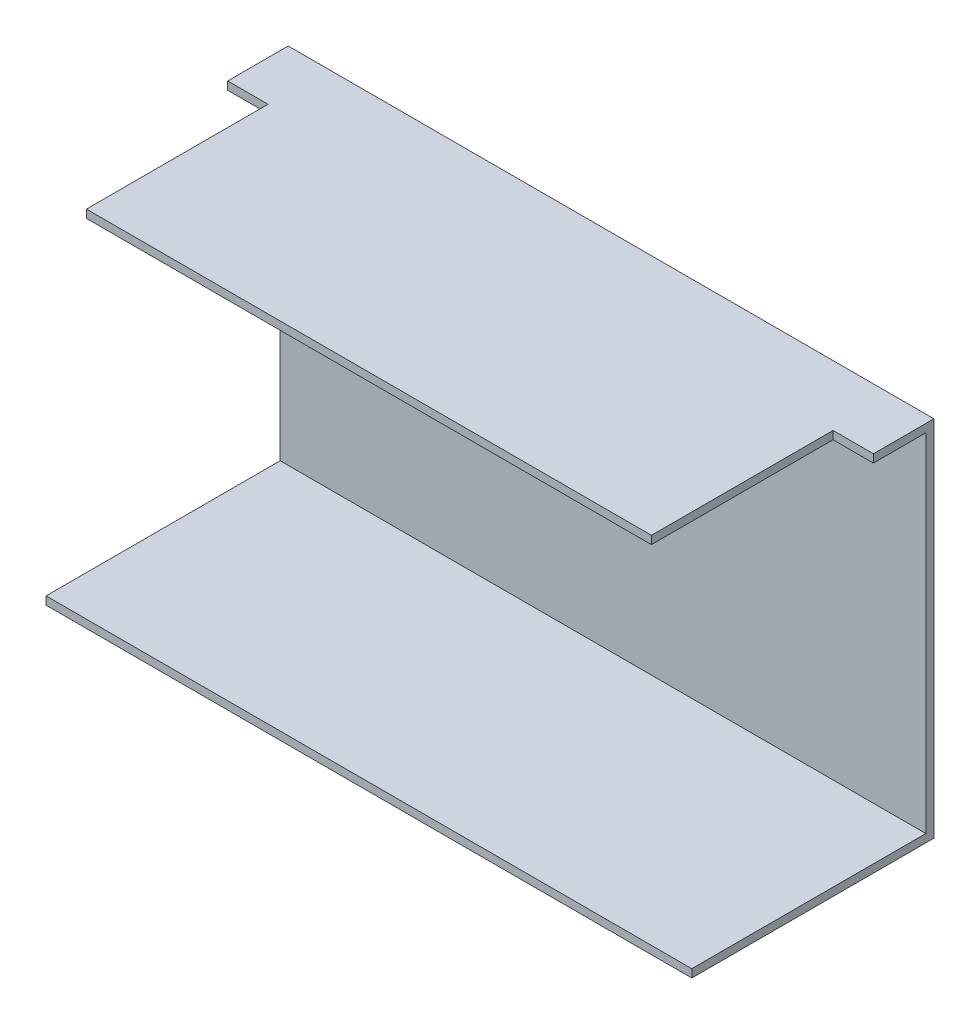
ISO-10303-21;
HEADER;
FILE_DESCRIPTION(('STEP AP214'),'2;1');
FILE_NAME('part.step','',(''),(''),'','','');
FILE_SCHEMA(('AUTOMOTIVE_DESIGN { 1 0 10303 214 1 1 1 1 }'));
ENDSEC;
DATA;
#1=APPLICATION_CONTEXT('core data for automotive mechanical design processes');
#2=APPLICATION_PROTOCOL_DEFINITION('international standard','automotive_design',2000,#1);
#3=PRODUCT_CONTEXT('',#1,'mechanical');
#4=PRODUCT('Part','Part','',(#3));
#5=PRODUCT_RELATED_PRODUCT_CATEGORY('part','',(#4));
#6=PRODUCT_DEFINITION_FORMATION('','',#4);
#7=PRODUCT_DEFINITION_CONTEXT('part definition',#1,'design');
#8=PRODUCT_DEFINITION('design','',#6,#7);
#9=PRODUCT_DEFINITION_SHAPE('','',#8);
#10=(LENGTH_UNIT() NAMED_UNIT(*) SI_UNIT(.MILLI.,.METRE.));
#11=(NAMED_UNIT(*) PLANE_ANGLE_UNIT() SI_UNIT($,.RADIAN.));
#12=(NAMED_UNIT(*) SI_UNIT($,.STERADIAN.) SOLID_ANGLE_UNIT());
#13=UNCERTAINTY_MEASURE_WITH_UNIT(LENGTH_MEASURE(1.E-05),#10,'distance_accuracy_value','');
#14=(GEOMETRIC_REPRESENTATION_CONTEXT(3) GLOBAL_UNCERTAINTY_ASSIGNED_CONTEXT((#13)) GLOBAL_UNIT_ASSIGNED_CONTEXT((#10,
#11,#12)) REPRESENTATION_CONTEXT('',''));
#15=CARTESIAN_POINT('',(0.,0.,0.));
#16=DIRECTION('',(0.,0.,1.));
#17=DIRECTION('',(1.,0.,0.));
#18=AXIS2_PLACEMENT_3D('',#15,#16,#17);
#19=CARTESIAN_POINT('',(0.4,0.225,-0.5));
#20=DIRECTION('',(0.,0.,-1.));
#21=DIRECTION('',(-1.,0.,0.));
#22=AXIS2_PLACEMENT_3D('',#19,#20,#21);
#23=PLANE('',#22);
#24=DIRECTION('',(-1.,0.,0.));
#25=VECTOR('',#24,1.);
#26=CARTESIAN_POINT('',(0.4,0.225,-0.5));
#27=LINE('',#26,#25);
#28=CARTESIAN_POINT('',(0.35,0.225,-0.5));
#29=VERTEX_POINT('',#28);
#30=CARTESIAN_POINT('',(-0.35,0.225,-0.5));
#31=VERTEX_POINT('',#30);
#32=EDGE_CURVE('E11',#29,#31,#27,.T.);
#33=ORIENTED_EDGE('',*,*,#32,.T.);
#34=DIRECTION('',(0.,1.,0.));
#35=VECTOR('',#34,1.);
#36=CARTESIAN_POINT('',(-0.35,-0.0154886114323226,-0.5));
#37=LINE('',#36,#35);
#38=CARTESIAN_POINT('',(-0.35,0.215,-0.5));
#39=VERTEX_POINT('',#38);
#40=EDGE_CURVE('E23',#39,#31,#37,.T.);
#41=ORIENTED_EDGE('',*,*,#40,.F.);
#42=DIRECTION('',(-1.,0.,0.));
#43=VECTOR('',#42,1.);
#44=CARTESIAN_POINT('',(0.4,0.215,-0.5));
#45=LINE('',#44,#43);
#46=CARTESIAN_POINT('',(0.35,0.215,-0.5));
#47=VERTEX_POINT('',#46);
#48=EDGE_CURVE('E193',#47,#39,#45,.T.);
#49=ORIENTED_EDGE('',*,*,#48,.F.);
#50=DIRECTION('',(0.,1.,0.));
#51=VECTOR('',#50,1.);
#52=CARTESIAN_POINT('',(0.35,-0.0154886114323226,-0.5));
#53=LINE('',#52,#51);
#54=EDGE_CURVE('E191',#47,#29,#53,.T.);
#55=ORIENTED_EDGE('',*,*,#54,.T.);
#56=EDGE_LOOP('',(#33,#41,#49,#55));
#57=FACE_BOUND('',#56,.T.);
#58=ADVANCED_FACE('F16',(#57),#23,.F.);
#59=CARTESIAN_POINT('',(0.4,0.215,-0.5));
#60=DIRECTION('',(0.,1.,0.));
#61=DIRECTION('',(0.,0.,1.));
#62=AXIS2_PLACEMENT_3D('',#59,#60,#61);
#63=PLANE('',#62);
#64=ORIENTED_EDGE('',*,*,#48,.T.);
#65=DIRECTION('',(0.,0.,-1.));
#66=VECTOR('',#65,1.);
#67=CARTESIAN_POINT('',(-0.35,0.215,-0.725));
#68=LINE('',#67,#66);
#69=CARTESIAN_POINT('',(-0.35,0.215,-0.725));
#70=VERTEX_POINT('',#69);
#71=EDGE_CURVE('E189',#39,#70,#68,.T.);
#72=ORIENTED_EDGE('',*,*,#71,.T.);
#73=DIRECTION('',(-1.,0.,0.));
#74=VECTOR('',#73,1.);
#75=CARTESIAN_POINT('',(-0.4,0.215,-0.725));
#76=LINE('',#75,#74);
#77=CARTESIAN_POINT('',(-0.4,0.215,-0.725));
#78=VERTEX_POINT('',#77);
#79=EDGE_CURVE('E187',#70,#78,#76,.T.);
#80=ORIENTED_EDGE('',*,*,#79,.T.);
#81=DIRECTION('',(0.,0.,-1.));
#82=VECTOR('',#81,1.);
#83=CARTESIAN_POINT('',(-0.4,0.215,-0.5));
#84=LINE('',#83,#82);
#85=CARTESIAN_POINT('',(-0.4,0.215,-0.79));
#86=VERTEX_POINT('',#85);
#87=EDGE_CURVE('E185',#78,#86,#84,.T.);
#88=ORIENTED_EDGE('',*,*,#87,.T.);
#89=DIRECTION('',(-1.,0.,0.));
#90=VECTOR('',#89,1.);
#91=CARTESIAN_POINT('',(0.4,0.215,-0.79));
#92=LINE('',#91,#90);
#93=CARTESIAN_POINT('',(0.4,0.215,-0.79));
#94=VERTEX_POINT('',#93);
#95=EDGE_CURVE('E182',#94,#86,#92,.T.);
#96=ORIENTED_EDGE('',*,*,#95,.F.);
#97=DIRECTION('',(0.,0.,-1.));
#98=VECTOR('',#97,1.);
#99=CARTESIAN_POINT('',(0.4,0.215,-0.5));
#100=LINE('',#99,#98);
#101=CARTESIAN_POINT('',(0.4,0.215,-0.725));
#102=VERTEX_POINT('',#101);
#103=EDGE_CURVE('E180',#102,#94,#100,.T.);
#104=ORIENTED_EDGE('',*,*,#103,.F.);
#105=DIRECTION('',(-1.,0.,0.));
#106=VECTOR('',#105,1.);
#107=CARTESIAN_POINT('',(0.4,0.215,-0.725));
#108=LINE('',#107,#106);
#109=CARTESIAN_POINT('',(0.35,0.215,-0.725));
#110=VERTEX_POINT('',#109);
#111=EDGE_CURVE('E124',#102,#110,#108,.T.);
#112=ORIENTED_EDGE('',*,*,#111,.T.);
#113=DIRECTION('',(0.,0.,1.));
#114=VECTOR('',#113,1.);
#115=CARTESIAN_POINT('',(0.35,0.215,-0.725));
#116=LINE('',#115,#114);
#117=EDGE_CURVE('E176',#110,#47,#116,.T.);
#118=ORIENTED_EDGE('',*,*,#117,.T.);
#119=EDGE_LOOP('',(#64,#72,#80,#88,#96,#104,#112,#118));
#120=FACE_BOUND('',#119,.T.);
#121=ADVANCED_FACE('F212',(#120),#63,.F.);
#122=CARTESIAN_POINT('',(0.4,0.215,-0.79));
#123=DIRECTION('',(0.,0.,-1.));
#124=DIRECTION('',(-1.,0.,0.));
#125=AXIS2_PLACEMENT_3D('',#122,#123,#124);
#126=PLANE('',#125);
#127=DIRECTION('',(0.,-1.,0.));
#128=VECTOR('',#127,1.);
#129=CARTESIAN_POINT('',(-0.4,0.215,-0.79));
#130=LINE('',#129,#128);
#131=CARTESIAN_POINT('',(-0.4,-0.215,-0.79));
#132=VERTEX_POINT('',#131);
#133=EDGE_CURVE('E174',#86,#132,#130,.T.);
#134=ORIENTED_EDGE('',*,*,#133,.T.);
#135=DIRECTION('',(-1.,0.,0.));
#136=VECTOR('',#135,1.);
#137=CARTESIAN_POINT('',(0.4,-0.215,-0.79));
#138=LINE('',#137,#136);
#139=CARTESIAN_POINT('',(0.4,-0.215,-0.79));
#140=VERTEX_POINT('',#139);
#141=EDGE_CURVE('E171',#140,#132,#138,.T.);
#142=ORIENTED_EDGE('',*,*,#141,.F.);
#143=DIRECTION('',(0.,-1.,0.));
#144=VECTOR('',#143,1.);
#145=CARTESIAN_POINT('',(0.4,0.215,-0.79));
#146=LINE('',#145,#144);
#147=EDGE_CURVE('E168',#94,#140,#146,.T.);
#148=ORIENTED_EDGE('',*,*,#147,.F.);
#149=ORIENTED_EDGE('',*,*,#95,.T.);
#150=EDGE_LOOP('',(#134,#142,#148,#149));
#151=FACE_BOUND('',#150,.T.);
#152=ADVANCED_FACE('F216',(#151),#126,.F.);
#153=CARTESIAN_POINT('',(0.4,-0.215,-0.79));
#154=DIRECTION('',(0.,-1.,0.));
#155=DIRECTION('',(0.,0.,-1.));
#156=AXIS2_PLACEMENT_3D('',#153,#154,#155);
#157=PLANE('',#156);
#158=DIRECTION('',(0.,0.,1.));
#159=VECTOR('',#158,1.);
#160=CARTESIAN_POINT('',(-0.4,-0.215,-0.79));
#161=LINE('',#160,#159);
#162=CARTESIAN_POINT('',(-0.4,-0.215,-0.5));
#163=VERTEX_POINT('',#162);
#164=EDGE_CURVE('E166',#132,#163,#161,.T.);
#165=ORIENTED_EDGE('',*,*,#164,.T.);
#166=DIRECTION('',(-1.,0.,0.));
#167=VECTOR('',#166,1.);
#168=CARTESIAN_POINT('',(0.4,-0.215,-0.5));
#169=LINE('',#168,#167);
#170=CARTESIAN_POINT('',(0.4,-0.215,-0.5));
#171=VERTEX_POINT('',#170);
#172=EDGE_CURVE('E163',#171,#163,#169,.T.);
#173=ORIENTED_EDGE('',*,*,#172,.F.);
#174=DIRECTION('',(0.,0.,1.));
#175=VECTOR('',#174,1.);
#176=CARTESIAN_POINT('',(0.4,-0.215,-0.79));
#177=LINE('',#176,#175);
#178=EDGE_CURVE('E160',#140,#171,#177,.T.);
#179=ORIENTED_EDGE('',*,*,#178,.F.);
#180=ORIENTED_EDGE('',*,*,#141,.T.);
#181=EDGE_LOOP('',(#165,#173,#179,#180));
#182=FACE_BOUND('',#181,.T.);
#183=ADVANCED_FACE('F220',(#182),#157,.F.);
#184=CARTESIAN_POINT('',(0.4,-0.215,-0.5));
#185=DIRECTION('',(0.,0.,-1.));
#186=DIRECTION('',(-1.,0.,0.));
#187=AXIS2_PLACEMENT_3D('',#184,#185,#186);
#188=PLANE('',#187);
#189=DIRECTION('',(0.,-1.,0.));
#190=VECTOR('',#189,1.);
#191=CARTESIAN_POINT('',(-0.4,-0.215,-0.5));
#192=LINE('',#191,#190);
#193=CARTESIAN_POINT('',(-0.4,-0.225,-0.5));
#194=VERTEX_POINT('',#193);
#195=EDGE_CURVE('E158',#163,#194,#192,.T.);
#196=ORIENTED_EDGE('',*,*,#195,.T.);
#197=DIRECTION('',(-1.,0.,0.));
#198=VECTOR('',#197,1.);
#199=CARTESIAN_POINT('',(0.4,-0.225,-0.5));
#200=LINE('',#199,#198);
#201=CARTESIAN_POINT('',(0.4,-0.225,-0.5));
#202=VERTEX_POINT('',#201);
#203=EDGE_CURVE('E155',#202,#194,#200,.T.);
#204=ORIENTED_EDGE('',*,*,#203,.F.);
#205=DIRECTION('',(0.,-1.,0.));
#206=VECTOR('',#205,1.);
#207=CARTESIAN_POINT('',(0.4,-0.215,-0.5));
#208=LINE('',#207,#206);
#209=EDGE_CURVE('E152',#171,#202,#208,.T.);
#210=ORIENTED_EDGE('',*,*,#209,.F.);
#211=ORIENTED_EDGE('',*,*,#172,.T.);
#212=EDGE_LOOP('',(#196,#204,#210,#211));
#213=FACE_BOUND('',#212,.T.);
#214=ADVANCED_FACE('F228',(#213),#188,.F.);
#215=CARTESIAN_POINT('',(0.4,-0.225,-0.8));
#216=DIRECTION('',(0.,1.,0.));
#217=DIRECTION('',(0.,0.,1.));
#218=AXIS2_PLACEMENT_3D('',#215,#216,#217);
#219=PLANE('',#218);
#220=DIRECTION('',(0.,0.,-1.));
#221=VECTOR('',#220,1.);
#222=CARTESIAN_POINT('',(-0.4,-0.225,-0.8));
#223=LINE('',#222,#221);
#224=CARTESIAN_POINT('',(-0.4,-0.225,-0.8));
#225=VERTEX_POINT('',#224);
#226=EDGE_CURVE('E150',#194,#225,#223,.T.);
#227=ORIENTED_EDGE('',*,*,#226,.T.);
#228=DIRECTION('',(-1.,0.,0.));
#229=VECTOR('',#228,1.);
#230=CARTESIAN_POINT('',(0.4,-0.225,-0.8));
#231=LINE('',#230,#229);
#232=CARTESIAN_POINT('',(0.4,-0.225,-0.8));
#233=VERTEX_POINT('',#232);
#234=EDGE_CURVE('E147',#233,#225,#231,.T.);
#235=ORIENTED_EDGE('',*,*,#234,.F.);
#236=DIRECTION('',(0.,0.,-1.));
#237=VECTOR('',#236,1.);
#238=CARTESIAN_POINT('',(0.4,-0.225,-0.8));
#239=LINE('',#238,#237);
#240=EDGE_CURVE('E145',#202,#233,#239,.T.);
#241=ORIENTED_EDGE('',*,*,#240,.F.);
#242=ORIENTED_EDGE('',*,*,#203,.T.);
#243=EDGE_LOOP('',(#227,#235,#241,#242));
#244=FACE_BOUND('',#243,.T.);
#245=ADVANCED_FACE('F232',(#244),#219,.F.);
#246=CARTESIAN_POINT('',(0.4,0.225,-0.8));
#247=DIRECTION('',(0.,0.,1.));
#248=DIRECTION('',(1.,0.,0.));
#249=AXIS2_PLACEMENT_3D('',#246,#247,#248);
#250=PLANE('',#249);
#251=DIRECTION('',(0.,1.,0.));
#252=VECTOR('',#251,1.);
#253=CARTESIAN_POINT('',(-0.4,0.225,-0.8));
#254=LINE('',#253,#252);
#255=CARTESIAN_POINT('',(-0.4,0.225,-0.8));
#256=VERTEX_POINT('',#255);
#257=EDGE_CURVE('E143',#225,#256,#254,.T.);
#258=ORIENTED_EDGE('',*,*,#257,.T.);
#259=DIRECTION('',(-1.,0.,0.));
#260=VECTOR('',#259,1.);
#261=CARTESIAN_POINT('',(0.4,0.225,-0.8));
#262=LINE('',#261,#260);
#263=CARTESIAN_POINT('',(0.4,0.225,-0.8));
#264=VERTEX_POINT('',#263);
#265=EDGE_CURVE('E141',#264,#256,#262,.T.);
#266=ORIENTED_EDGE('',*,*,#265,.F.);
#267=DIRECTION('',(0.,1.,0.));
#268=VECTOR('',#267,1.);
#269=CARTESIAN_POINT('',(0.4,0.225,-0.8));
#270=LINE('',#269,#268);
#271=EDGE_CURVE('E119',#233,#264,#270,.T.);
#272=ORIENTED_EDGE('',*,*,#271,.F.);
#273=ORIENTED_EDGE('',*,*,#234,.T.);
#274=EDGE_LOOP('',(#258,#266,#272,#273));
#275=FACE_BOUND('',#274,.T.);
#276=ADVANCED_FACE('F234',(#275),#250,.F.);
#277=CARTESIAN_POINT('',(0.4,0.225,-0.5));
#278=DIRECTION('',(0.,-1.,0.));
#279=DIRECTION('',(0.,0.,-1.));
#280=AXIS2_PLACEMENT_3D('',#277,#278,#279);
#281=PLANE('',#280);
#282=DIRECTION('',(-1.,0.,0.));
#283=VECTOR('',#282,1.);
#284=CARTESIAN_POINT('',(-0.4,0.225,-0.725));
#285=LINE('',#284,#283);
#286=CARTESIAN_POINT('',(-0.35,0.225,-0.725));
#287=VERTEX_POINT('',#286);
#288=CARTESIAN_POINT('',(-0.4,0.225,-0.725));
#289=VERTEX_POINT('',#288);
#290=EDGE_CURVE('E138',#287,#289,#285,.T.);
#291=ORIENTED_EDGE('',*,*,#290,.F.);
#292=DIRECTION('',(0.,0.,-1.));
#293=VECTOR('',#292,1.);
#294=CARTESIAN_POINT('',(-0.35,0.225,-0.725));
#295=LINE('',#294,#293);
#296=EDGE_CURVE('E135',#31,#287,#295,.T.);
#297=ORIENTED_EDGE('',*,*,#296,.F.);
#298=ORIENTED_EDGE('',*,*,#32,.F.);
#299=DIRECTION('',(0.,0.,1.));
#300=VECTOR('',#299,1.);
#301=CARTESIAN_POINT('',(0.35,0.225,-0.725));
#302=LINE('',#301,#300);
#303=CARTESIAN_POINT('',(0.35,0.225,-0.725));
#304=VERTEX_POINT('',#303);
#305=EDGE_CURVE('E105',#304,#29,#302,.T.);
#306=ORIENTED_EDGE('',*,*,#305,.F.);
#307=DIRECTION('',(-1.,0.,0.));
#308=VECTOR('',#307,1.);
#309=CARTESIAN_POINT('',(0.4,0.225,-0.725));
#310=LINE('',#309,#308);
#311=CARTESIAN_POINT('',(0.4,0.225,-0.725));
#312=VERTEX_POINT('',#311);
#313=EDGE_CURVE('E99',#312,#304,#310,.T.);
#314=ORIENTED_EDGE('',*,*,#313,.F.);
#315=DIRECTION('',(0.,0.,1.));
#316=VECTOR('',#315,1.);
#317=CARTESIAN_POINT('',(0.4,0.225,-0.5));
#318=LINE('',#317,#316);
#319=EDGE_CURVE('E103',#264,#312,#318,.T.);
#320=ORIENTED_EDGE('',*,*,#319,.F.);
#321=ORIENTED_EDGE('',*,*,#265,.T.);
#322=DIRECTION('',(0.,0.,1.));
#323=VECTOR('',#322,1.);
#324=CARTESIAN_POINT('',(-0.4,0.225,-0.5));
#325=LINE('',#324,#323);
#326=EDGE_CURVE('E120',#256,#289,#325,.T.);
#327=ORIENTED_EDGE('',*,*,#326,.T.);
#328=EDGE_LOOP('',(#291,#297,#298,#306,#314,#320,#321,#327));
#329=FACE_BOUND('',#328,.T.);
#330=ADVANCED_FACE('F101',(#329),#281,.F.);
#331=CARTESIAN_POINT('',(0.4,0.215,-0.5));
#332=DIRECTION('',(1.,0.,0.));
#333=DIRECTION('',(0.,0.,-1.));
#334=AXIS2_PLACEMENT_3D('',#331,#332,#333);
#335=PLANE('',#334);
#336=DIRECTION('',(0.,1.,0.));
#337=VECTOR('',#336,1.);
#338=CARTESIAN_POINT('',(0.4,-0.0154886114323226,-0.725));
#339=LINE('',#338,#337);
#340=EDGE_CURVE('E116',#102,#312,#339,.T.);
#341=ORIENTED_EDGE('',*,*,#340,.F.);
#342=ORIENTED_EDGE('',*,*,#103,.T.);
#343=ORIENTED_EDGE('',*,*,#147,.T.);
#344=ORIENTED_EDGE('',*,*,#178,.T.);
#345=ORIENTED_EDGE('',*,*,#209,.T.);
#346=ORIENTED_EDGE('',*,*,#240,.T.);
#347=ORIENTED_EDGE('',*,*,#271,.T.);
#348=ORIENTED_EDGE('',*,*,#319,.T.);
#349=EDGE_LOOP('',(#341,#342,#343,#344,#345,#346,#347,#348));
#350=FACE_BOUND('',#349,.T.);
#351=ADVANCED_FACE('F114',(#350),#335,.T.);
#352=CARTESIAN_POINT('',(-0.4,0.215,-0.5));
#353=DIRECTION('',(1.,0.,0.));
#354=DIRECTION('',(0.,0.,-1.));
#355=AXIS2_PLACEMENT_3D('',#352,#353,#354);
#356=PLANE('',#355);
#357=ORIENTED_EDGE('',*,*,#87,.F.);
#358=DIRECTION('',(0.,1.,0.));
#359=VECTOR('',#358,1.);
#360=CARTESIAN_POINT('',(-0.4,-0.0154886114323226,-0.725));
#361=LINE('',#360,#359);
#362=EDGE_CURVE('E125',#78,#289,#361,.T.);
#363=ORIENTED_EDGE('',*,*,#362,.T.);
#364=ORIENTED_EDGE('',*,*,#326,.F.);
#365=ORIENTED_EDGE('',*,*,#257,.F.);
#366=ORIENTED_EDGE('',*,*,#226,.F.);
#367=ORIENTED_EDGE('',*,*,#195,.F.);
#368=ORIENTED_EDGE('',*,*,#164,.F.);
#369=ORIENTED_EDGE('',*,*,#133,.F.);
#370=EDGE_LOOP('',(#357,#363,#364,#365,#366,#367,#368,#369));
#371=FACE_BOUND('',#370,.T.);
#372=ADVANCED_FACE('F224',(#371),#356,.F.);
#373=CARTESIAN_POINT('',(-0.35,-0.0154886114323226,-0.725));
#374=DIRECTION('',(1.,0.,0.));
#375=DIRECTION('',(0.,0.,-1.));
#376=AXIS2_PLACEMENT_3D('',#373,#374,#375);
#377=PLANE('',#376);
#378=ORIENTED_EDGE('',*,*,#40,.T.);
#379=ORIENTED_EDGE('',*,*,#296,.T.);
#380=DIRECTION('',(0.,1.,0.));
#381=VECTOR('',#380,1.);
#382=CARTESIAN_POINT('',(-0.35,-0.0154886114323226,-0.725));
#383=LINE('',#382,#381);
#384=EDGE_CURVE('E130',#70,#287,#383,.T.);
#385=ORIENTED_EDGE('',*,*,#384,.F.);
#386=ORIENTED_EDGE('',*,*,#71,.F.);
#387=EDGE_LOOP('',(#378,#379,#385,#386));
#388=FACE_BOUND('',#387,.T.);
#389=ADVANCED_FACE('F197',(#388),#377,.F.);
#390=CARTESIAN_POINT('',(-0.4,-0.0154886114323226,-0.725));
#391=DIRECTION('',(0.,0.,-1.));
#392=DIRECTION('',(0.,1.,0.));
#393=AXIS2_PLACEMENT_3D('',#390,#391,#392);
#394=PLANE('',#393);
#395=ORIENTED_EDGE('',*,*,#384,.T.);
#396=ORIENTED_EDGE('',*,*,#290,.T.);
#397=ORIENTED_EDGE('',*,*,#362,.F.);
#398=ORIENTED_EDGE('',*,*,#79,.F.);
#399=EDGE_LOOP('',(#395,#396,#397,#398));
#400=FACE_BOUND('',#399,.T.);
#401=ADVANCED_FACE('F203',(#400),#394,.F.);
#402=CARTESIAN_POINT('',(0.35,-0.0154886114323226,-0.725));
#403=DIRECTION('',(-1.,0.,0.));
#404=DIRECTION('',(0.,0.,1.));
#405=AXIS2_PLACEMENT_3D('',#402,#403,#404);
#406=PLANE('',#405);
#407=DIRECTION('',(0.,1.,0.));
#408=VECTOR('',#407,1.);
#409=CARTESIAN_POINT('',(0.35,-0.0154886114323226,-0.725));
#410=LINE('',#409,#408);
#411=EDGE_CURVE('E205',#110,#304,#410,.T.);
#412=ORIENTED_EDGE('',*,*,#411,.T.);
#413=ORIENTED_EDGE('',*,*,#305,.T.);
#414=ORIENTED_EDGE('',*,*,#54,.F.);
#415=ORIENTED_EDGE('',*,*,#117,.F.);
#416=EDGE_LOOP('',(#412,#413,#414,#415));
#417=FACE_BOUND('',#416,.T.);
#418=ADVANCED_FACE('F209',(#417),#406,.F.);
#419=CARTESIAN_POINT('',(0.4,-0.0154886114323226,-0.725));
#420=DIRECTION('',(0.,0.,-1.));
#421=DIRECTION('',(0.,1.,0.));
#422=AXIS2_PLACEMENT_3D('',#419,#420,#421);
#423=PLANE('',#422);
#424=ORIENTED_EDGE('',*,*,#340,.T.);
#425=ORIENTED_EDGE('',*,*,#313,.T.);
#426=ORIENTED_EDGE('',*,*,#411,.F.);
#427=ORIENTED_EDGE('',*,*,#111,.F.);
#428=EDGE_LOOP('',(#424,#425,#426,#427));
#429=FACE_BOUND('',#428,.T.);
#430=ADVANCED_FACE('F123',(#429),#423,.F.);
#431=CLOSED_SHELL('',(#58,#121,#152,#183,#214,#245,#276,#330,#351,#372,#389,#401,#418,#430));
#432=MANIFOLD_SOLID_BREP('B1',#431);
#433=ADVANCED_BREP_SHAPE_REPRESENTATION('',(#18,#432),#14);
#434=SHAPE_DEFINITION_REPRESENTATION(#9,#433);
ENDSEC;
END-ISO-10303-21;
